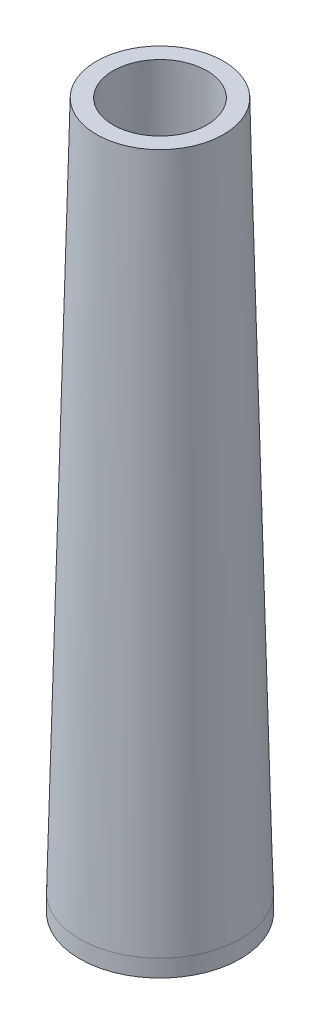
ISO-10303-21;
HEADER;
FILE_DESCRIPTION(('STEP AP214'),'2;1');
FILE_NAME('part.step','',(''),(''),'','','');
FILE_SCHEMA(('AUTOMOTIVE_DESIGN { 1 0 10303 214 1 1 1 1 }'));
ENDSEC;
DATA;
#1=APPLICATION_CONTEXT('core data for automotive mechanical design processes');
#2=APPLICATION_PROTOCOL_DEFINITION('international standard','automotive_design',2000,#1);
#3=PRODUCT_CONTEXT('',#1,'mechanical');
#4=PRODUCT('Part','Part','',(#3));
#5=PRODUCT_RELATED_PRODUCT_CATEGORY('part','',(#4));
#6=PRODUCT_DEFINITION_FORMATION('','',#4);
#7=PRODUCT_DEFINITION_CONTEXT('part definition',#1,'design');
#8=PRODUCT_DEFINITION('design','',#6,#7);
#9=PRODUCT_DEFINITION_SHAPE('','',#8);
#10=(LENGTH_UNIT() NAMED_UNIT(*) SI_UNIT(.MILLI.,.METRE.));
#11=(NAMED_UNIT(*) PLANE_ANGLE_UNIT() SI_UNIT($,.RADIAN.));
#12=(NAMED_UNIT(*) SI_UNIT($,.STERADIAN.) SOLID_ANGLE_UNIT());
#13=UNCERTAINTY_MEASURE_WITH_UNIT(LENGTH_MEASURE(1.E-05),#10,'distance_accuracy_value','');
#14=(GEOMETRIC_REPRESENTATION_CONTEXT(3) GLOBAL_UNCERTAINTY_ASSIGNED_CONTEXT((#13)) GLOBAL_UNIT_ASSIGNED_CONTEXT((#10,
#11,#12)) REPRESENTATION_CONTEXT('',''));
#15=CARTESIAN_POINT('',(0.,0.,0.));
#16=DIRECTION('',(0.,0.,1.));
#17=DIRECTION('',(1.,0.,0.));
#18=AXIS2_PLACEMENT_3D('',#15,#16,#17);
#19=CARTESIAN_POINT('',(0.,0.,0.));
#20=DIRECTION('',(0.,1.,0.));
#21=DIRECTION('',(0.,0.,1.));
#22=AXIS2_PLACEMENT_3D('',#19,#20,#21);
#23=CYLINDRICAL_SURFACE('',#22,9.);
#24=CARTESIAN_POINT('',(0.,0.,0.));
#25=DIRECTION('',(0.,1.,0.));
#26=DIRECTION('',(0.,0.,1.));
#27=AXIS2_PLACEMENT_3D('',#24,#25,#26);
#28=CIRCLE('',#27,9.);
#29=CARTESIAN_POINT('',(0.,0.,9.));
#30=VERTEX_POINT('',#29);
#31=EDGE_CURVE('E68',#30,#30,#28,.T.);
#32=ORIENTED_EDGE('',*,*,#31,.F.);
#33=EDGE_LOOP('',(#32));
#34=FACE_BOUND('',#33,.T.);
#35=CARTESIAN_POINT('',(0.,105.,0.));
#36=DIRECTION('',(0.,-1.,0.));
#37=DIRECTION('',(1.,0.,0.));
#38=AXIS2_PLACEMENT_3D('',#35,#36,#37);
#39=CIRCLE('',#38,9.);
#40=CARTESIAN_POINT('',(9.,105.,0.));
#41=VERTEX_POINT('',#40);
#42=EDGE_CURVE('E11',#41,#41,#39,.T.);
#43=ORIENTED_EDGE('',*,*,#42,.F.);
#44=EDGE_LOOP('',(#43));
#45=FACE_BOUND('',#44,.T.);
#46=ADVANCED_FACE('F44',(#34,#45),#23,.F.);
#47=CARTESIAN_POINT('',(0.,3.,0.));
#48=DIRECTION('',(0.,-1.,0.));
#49=DIRECTION('',(0.,0.,-1.));
#50=AXIS2_PLACEMENT_3D('',#47,#48,#49);
#51=CYLINDRICAL_SURFACE('',#50,14.);
#52=CARTESIAN_POINT('',(0.,3.,0.));
#53=DIRECTION('',(0.,1.,0.));
#54=DIRECTION('',(0.,0.,1.));
#55=AXIS2_PLACEMENT_3D('',#52,#53,#54);
#56=CIRCLE('',#55,14.);
#57=CARTESIAN_POINT('',(0.,3.,14.));
#58=VERTEX_POINT('',#57);
#59=EDGE_CURVE('E52',#58,#58,#56,.T.);
#60=ORIENTED_EDGE('',*,*,#59,.F.);
#61=EDGE_LOOP('',(#60));
#62=FACE_BOUND('',#61,.T.);
#63=CARTESIAN_POINT('',(0.,0.,0.));
#64=DIRECTION('',(0.,1.,0.));
#65=DIRECTION('',(0.,0.,1.));
#66=AXIS2_PLACEMENT_3D('',#63,#64,#65);
#67=CIRCLE('',#66,14.);
#68=CARTESIAN_POINT('',(0.,0.,14.));
#69=VERTEX_POINT('',#68);
#70=EDGE_CURVE('E57',#69,#69,#67,.T.);
#71=ORIENTED_EDGE('',*,*,#70,.T.);
#72=EDGE_LOOP('',(#71));
#73=FACE_BOUND('',#72,.T.);
#74=ADVANCED_FACE('F46',(#62,#73),#51,.T.);
#75=CARTESIAN_POINT('',(0.,0.,0.));
#76=DIRECTION('',(0.,1.,0.));
#77=DIRECTION('',(0.,0.,1.));
#78=AXIS2_PLACEMENT_3D('',#75,#76,#77);
#79=PLANE('',#78);
#80=ORIENTED_EDGE('',*,*,#31,.T.);
#81=EDGE_LOOP('',(#80));
#82=FACE_BOUND('',#81,.T.);
#83=ORIENTED_EDGE('',*,*,#70,.F.);
#84=EDGE_LOOP('',(#83));
#85=FACE_BOUND('',#84,.T.);
#86=ADVANCED_FACE('F90',(#82,#85),#79,.F.);
#87=CARTESIAN_POINT('',(0.,3.,0.));
#88=DIRECTION('',(0.,-1.,0.));
#89=DIRECTION('',(0.,0.,-1.));
#90=AXIS2_PLACEMENT_3D('',#87,#88,#89);
#91=CONICAL_SURFACE('',#90,14.,0.0243701743275819);
#92=CARTESIAN_POINT('',(0.,123.,0.));
#93=DIRECTION('',(0.,-1.,0.));
#94=DIRECTION('',(0.,0.,-1.));
#95=AXIS2_PLACEMENT_3D('',#92,#93,#94);
#96=CIRCLE('',#95,11.075);
#97=CARTESIAN_POINT('',(0.,123.,-11.075));
#98=VERTEX_POINT('',#97);
#99=EDGE_CURVE('E63',#98,#98,#96,.T.);
#100=ORIENTED_EDGE('',*,*,#99,.T.);
#101=EDGE_LOOP('',(#100));
#102=FACE_BOUND('',#101,.T.);
#103=ORIENTED_EDGE('',*,*,#59,.T.);
#104=EDGE_LOOP('',(#103));
#105=FACE_BOUND('',#104,.T.);
#106=ADVANCED_FACE('F81',(#102,#105),#91,.T.);
#107=CARTESIAN_POINT('',(0.,123.,0.));
#108=DIRECTION('',(0.,1.,0.));
#109=DIRECTION('',(0.,0.,1.));
#110=AXIS2_PLACEMENT_3D('',#107,#108,#109);
#111=PLANE('',#110);
#112=ORIENTED_EDGE('',*,*,#99,.F.);
#113=EDGE_LOOP('',(#112));
#114=FACE_BOUND('',#113,.T.);
#115=CARTESIAN_POINT('',(0.,123.,0.));
#116=DIRECTION('',(0.,1.,0.));
#117=DIRECTION('',(-1.,0.,0.));
#118=AXIS2_PLACEMENT_3D('',#115,#116,#117);
#119=CIRCLE('',#118,8.18262478293278);
#120=CARTESIAN_POINT('',(-8.18262478293278,123.,0.));
#121=VERTEX_POINT('',#120);
#122=EDGE_CURVE('E72',#121,#121,#119,.T.);
#123=ORIENTED_EDGE('',*,*,#122,.F.);
#124=EDGE_LOOP('',(#123));
#125=FACE_BOUND('',#124,.T.);
#126=ADVANCED_FACE('F79',(#114,#125),#111,.T.);
#127=CARTESIAN_POINT('',(0.,123.,0.));
#128=DIRECTION('',(0.,-1.,0.));
#129=DIRECTION('',(1.,0.,0.));
#130=AXIS2_PLACEMENT_3D('',#127,#128,#129);
#131=CONICAL_SURFACE('',#130,8.18262478293278,0.0453785605518459);
#132=ORIENTED_EDGE('',*,*,#42,.T.);
#133=EDGE_LOOP('',(#132));
#134=FACE_BOUND('',#133,.T.);
#135=ORIENTED_EDGE('',*,*,#122,.T.);
#136=EDGE_LOOP('',(#135));
#137=FACE_BOUND('',#136,.T.);
#138=ADVANCED_FACE('F77',(#134,#137),#131,.F.);
#139=CLOSED_SHELL('',(#46,#74,#86,#106,#126,#138));
#140=MANIFOLD_SOLID_BREP('B2',#139);
#141=ADVANCED_BREP_SHAPE_REPRESENTATION('',(#18,#140),#14);
#142=SHAPE_DEFINITION_REPRESENTATION(#9,#141);
ENDSEC;
END-ISO-10303-21;
